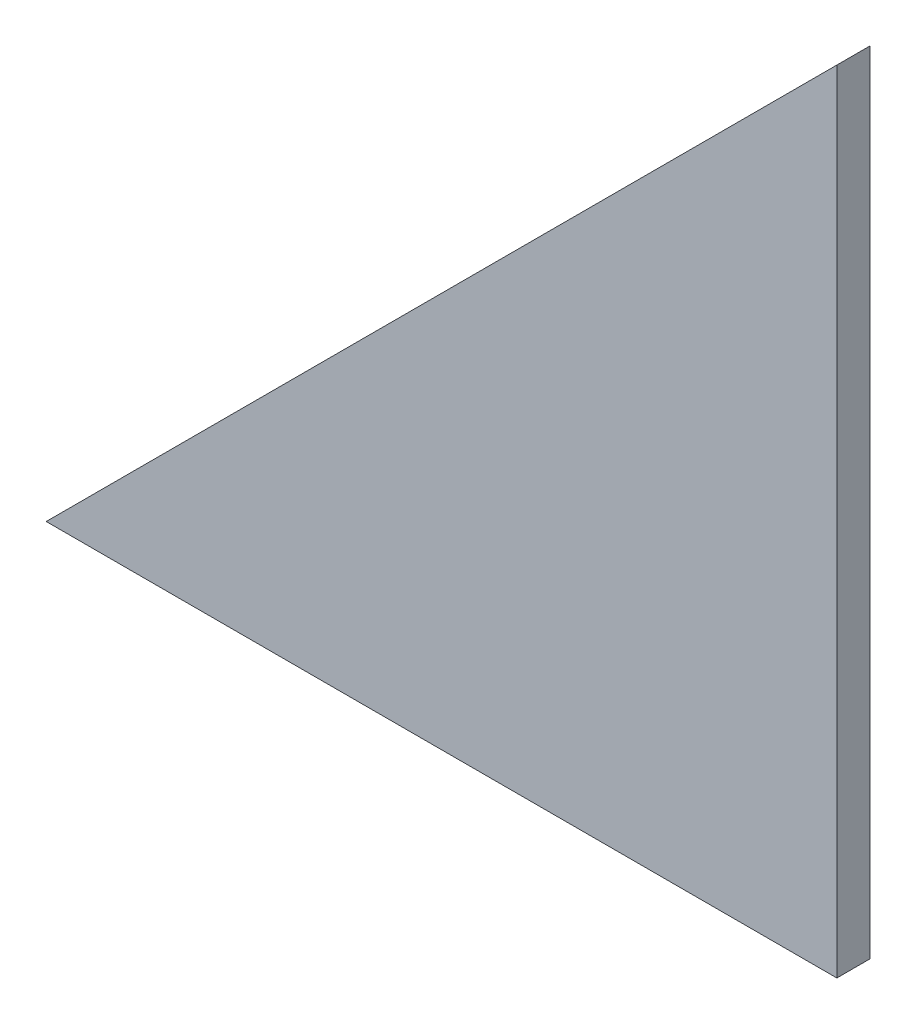
ISO-10303-21;
HEADER;
FILE_DESCRIPTION(('STEP AP214'),'2;1');
FILE_NAME('part.step','',(''),(''),'','','');
FILE_SCHEMA(('AUTOMOTIVE_DESIGN { 1 0 10303 214 1 1 1 1 }'));
ENDSEC;
DATA;
#1=APPLICATION_CONTEXT('core data for automotive mechanical design processes');
#2=APPLICATION_PROTOCOL_DEFINITION('international standard','automotive_design',2000,#1);
#3=PRODUCT_CONTEXT('',#1,'mechanical');
#4=PRODUCT('Part','Part','',(#3));
#5=PRODUCT_RELATED_PRODUCT_CATEGORY('part','',(#4));
#6=PRODUCT_DEFINITION_FORMATION('','',#4);
#7=PRODUCT_DEFINITION_CONTEXT('part definition',#1,'design');
#8=PRODUCT_DEFINITION('design','',#6,#7);
#9=PRODUCT_DEFINITION_SHAPE('','',#8);
#10=(LENGTH_UNIT() NAMED_UNIT(*) SI_UNIT(.MILLI.,.METRE.));
#11=(NAMED_UNIT(*) PLANE_ANGLE_UNIT() SI_UNIT($,.RADIAN.));
#12=(NAMED_UNIT(*) SI_UNIT($,.STERADIAN.) SOLID_ANGLE_UNIT());
#13=UNCERTAINTY_MEASURE_WITH_UNIT(LENGTH_MEASURE(1.E-05),#10,'distance_accuracy_value','');
#14=(GEOMETRIC_REPRESENTATION_CONTEXT(3) GLOBAL_UNCERTAINTY_ASSIGNED_CONTEXT((#13)) GLOBAL_UNIT_ASSIGNED_CONTEXT((#10,
#11,#12)) REPRESENTATION_CONTEXT('',''));
#15=CARTESIAN_POINT('',(0.,0.,0.));
#16=DIRECTION('',(0.,0.,1.));
#17=DIRECTION('',(1.,0.,0.));
#18=AXIS2_PLACEMENT_3D('',#15,#16,#17);
#19=CARTESIAN_POINT('',(76.2,76.2,3.175));
#20=DIRECTION('',(0.707106781186548,-0.707106781186548,0.));
#21=DIRECTION('',(0.707106781186548,0.707106781186548,0.));
#22=AXIS2_PLACEMENT_3D('',#19,#20,#21);
#23=PLANE('',#22);
#24=DIRECTION('',(-0.707106781186547,-0.707106781186547,0.));
#25=VECTOR('',#24,1.);
#26=CARTESIAN_POINT('',(76.2,76.2,0.));
#27=LINE('',#26,#25);
#28=CARTESIAN_POINT('',(76.2,76.2,0.));
#29=VERTEX_POINT('',#28);
#30=CARTESIAN_POINT('',(0.,0.,0.));
#31=VERTEX_POINT('',#30);
#32=EDGE_CURVE('E95',#29,#31,#27,.T.);
#33=ORIENTED_EDGE('',*,*,#32,.T.);
#34=DIRECTION('',(0.,0.,-1.));
#35=VECTOR('',#34,1.);
#36=CARTESIAN_POINT('',(0.,0.,3.175));
#37=LINE('',#36,#35);
#38=CARTESIAN_POINT('',(0.,0.,3.175));
#39=VERTEX_POINT('',#38);
#40=EDGE_CURVE('E11',#39,#31,#37,.T.);
#41=ORIENTED_EDGE('',*,*,#40,.F.);
#42=DIRECTION('',(-0.707106781186547,-0.707106781186547,0.));
#43=VECTOR('',#42,1.);
#44=CARTESIAN_POINT('',(76.2,76.2,3.175));
#45=LINE('',#44,#43);
#46=CARTESIAN_POINT('',(76.2,76.2,3.175));
#47=VERTEX_POINT('',#46);
#48=EDGE_CURVE('E87',#47,#39,#45,.T.);
#49=ORIENTED_EDGE('',*,*,#48,.F.);
#50=DIRECTION('',(0.,0.,-1.));
#51=VECTOR('',#50,1.);
#52=CARTESIAN_POINT('',(76.2,76.2,3.175));
#53=LINE('',#52,#51);
#54=EDGE_CURVE('E96',#47,#29,#53,.T.);
#55=ORIENTED_EDGE('',*,*,#54,.T.);
#56=EDGE_LOOP('',(#33,#41,#49,#55));
#57=FACE_BOUND('',#56,.T.);
#58=ADVANCED_FACE('F45',(#57),#23,.F.);
#59=CARTESIAN_POINT('',(0.,0.,3.175));
#60=DIRECTION('',(0.,1.,0.));
#61=DIRECTION('',(0.,0.,1.));
#62=AXIS2_PLACEMENT_3D('',#59,#60,#61);
#63=PLANE('',#62);
#64=DIRECTION('',(1.,0.,0.));
#65=VECTOR('',#64,1.);
#66=CARTESIAN_POINT('',(0.,0.,0.));
#67=LINE('',#66,#65);
#68=CARTESIAN_POINT('',(76.2,0.,0.));
#69=VERTEX_POINT('',#68);
#70=EDGE_CURVE('E74',#31,#69,#67,.T.);
#71=ORIENTED_EDGE('',*,*,#70,.T.);
#72=DIRECTION('',(0.,0.,-1.));
#73=VECTOR('',#72,1.);
#74=CARTESIAN_POINT('',(76.2,0.,3.175));
#75=LINE('',#74,#73);
#76=CARTESIAN_POINT('',(76.2,0.,3.175));
#77=VERTEX_POINT('',#76);
#78=EDGE_CURVE('E54',#77,#69,#75,.T.);
#79=ORIENTED_EDGE('',*,*,#78,.F.);
#80=DIRECTION('',(1.,0.,0.));
#81=VECTOR('',#80,1.);
#82=CARTESIAN_POINT('',(0.,0.,3.175));
#83=LINE('',#82,#81);
#84=EDGE_CURVE('E82',#39,#77,#83,.T.);
#85=ORIENTED_EDGE('',*,*,#84,.F.);
#86=ORIENTED_EDGE('',*,*,#40,.T.);
#87=EDGE_LOOP('',(#71,#79,#85,#86));
#88=FACE_BOUND('',#87,.T.);
#89=ADVANCED_FACE('F83',(#88),#63,.F.);
#90=CARTESIAN_POINT('',(76.2,0.,3.175));
#91=DIRECTION('',(-1.,0.,0.));
#92=DIRECTION('',(0.,0.,1.));
#93=AXIS2_PLACEMENT_3D('',#90,#91,#92);
#94=PLANE('',#93);
#95=DIRECTION('',(0.,1.,0.));
#96=VECTOR('',#95,1.);
#97=CARTESIAN_POINT('',(76.2,0.,0.));
#98=LINE('',#97,#96);
#99=EDGE_CURVE('E79',#69,#29,#98,.T.);
#100=ORIENTED_EDGE('',*,*,#99,.T.);
#101=ORIENTED_EDGE('',*,*,#54,.F.);
#102=DIRECTION('',(0.,1.,0.));
#103=VECTOR('',#102,1.);
#104=CARTESIAN_POINT('',(76.2,0.,3.175));
#105=LINE('',#104,#103);
#106=EDGE_CURVE('E62',#77,#47,#105,.T.);
#107=ORIENTED_EDGE('',*,*,#106,.F.);
#108=ORIENTED_EDGE('',*,*,#78,.T.);
#109=EDGE_LOOP('',(#100,#101,#107,#108));
#110=FACE_BOUND('',#109,.T.);
#111=ADVANCED_FACE('F108',(#110),#94,.F.);
#112=CARTESIAN_POINT('',(0.,0.,3.175));
#113=DIRECTION('',(0.,0.,1.));
#114=DIRECTION('',(1.,0.,0.));
#115=AXIS2_PLACEMENT_3D('',#112,#113,#114);
#116=PLANE('',#115);
#117=ORIENTED_EDGE('',*,*,#48,.T.);
#118=ORIENTED_EDGE('',*,*,#84,.T.);
#119=ORIENTED_EDGE('',*,*,#106,.T.);
#120=EDGE_LOOP('',(#117,#118,#119));
#121=FACE_BOUND('',#120,.T.);
#122=ADVANCED_FACE('F90',(#121),#116,.T.);
#123=CARTESIAN_POINT('',(0.,0.,0.));
#124=DIRECTION('',(0.,0.,1.));
#125=DIRECTION('',(1.,0.,0.));
#126=AXIS2_PLACEMENT_3D('',#123,#124,#125);
#127=PLANE('',#126);
#128=ORIENTED_EDGE('',*,*,#32,.F.);
#129=ORIENTED_EDGE('',*,*,#99,.F.);
#130=ORIENTED_EDGE('',*,*,#70,.F.);
#131=EDGE_LOOP('',(#128,#129,#130));
#132=FACE_BOUND('',#131,.T.);
#133=ADVANCED_FACE('F109',(#132),#127,.F.);
#134=CLOSED_SHELL('',(#58,#89,#111,#122,#133));
#135=MANIFOLD_SOLID_BREP('B2',#134);
#136=ADVANCED_BREP_SHAPE_REPRESENTATION('',(#18,#135),#14);
#137=SHAPE_DEFINITION_REPRESENTATION(#9,#136);
ENDSEC;
END-ISO-10303-21;
